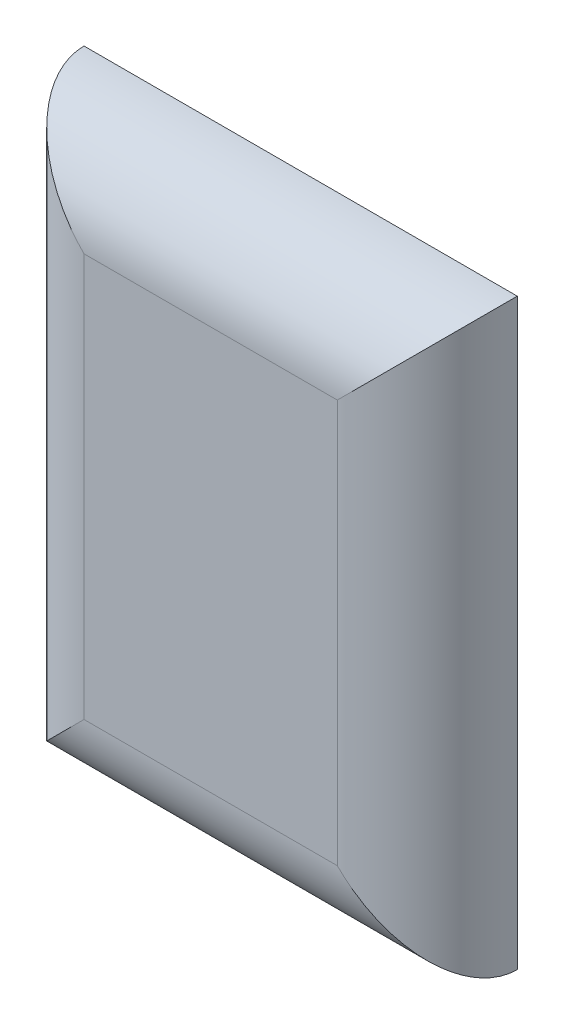
ISO-10303-21;
HEADER;
FILE_DESCRIPTION(('STEP AP214'),'2;1');
FILE_NAME('part.step','',(''),(''),'','','');
FILE_SCHEMA(('AUTOMOTIVE_DESIGN { 1 0 10303 214 1 1 1 1 }'));
ENDSEC;
DATA;
#1=APPLICATION_CONTEXT('core data for automotive mechanical design processes');
#2=APPLICATION_PROTOCOL_DEFINITION('international standard','automotive_design',2000,#1);
#3=PRODUCT_CONTEXT('',#1,'mechanical');
#4=PRODUCT('Part','Part','',(#3));
#5=PRODUCT_RELATED_PRODUCT_CATEGORY('part','',(#4));
#6=PRODUCT_DEFINITION_FORMATION('','',#4);
#7=PRODUCT_DEFINITION_CONTEXT('part definition',#1,'design');
#8=PRODUCT_DEFINITION('design','',#6,#7);
#9=PRODUCT_DEFINITION_SHAPE('','',#8);
#10=(LENGTH_UNIT() NAMED_UNIT(*) SI_UNIT(.MILLI.,.METRE.));
#11=(NAMED_UNIT(*) PLANE_ANGLE_UNIT() SI_UNIT($,.RADIAN.));
#12=(NAMED_UNIT(*) SI_UNIT($,.STERADIAN.) SOLID_ANGLE_UNIT());
#13=UNCERTAINTY_MEASURE_WITH_UNIT(LENGTH_MEASURE(1.E-05),#10,'distance_accuracy_value','');
#14=(GEOMETRIC_REPRESENTATION_CONTEXT(3) GLOBAL_UNCERTAINTY_ASSIGNED_CONTEXT((#13)) GLOBAL_UNIT_ASSIGNED_CONTEXT((#10,
#11,#12)) REPRESENTATION_CONTEXT('',''));
#15=CARTESIAN_POINT('',(0.,0.,0.));
#16=DIRECTION('',(0.,0.,1.));
#17=DIRECTION('',(1.,0.,0.));
#18=AXIS2_PLACEMENT_3D('',#15,#16,#17);
#19=CARTESIAN_POINT('',(0.,0.,54.));
#20=DIRECTION('',(0.,0.,1.));
#21=DIRECTION('',(1.,0.,0.));
#22=AXIS2_PLACEMENT_3D('',#19,#20,#21);
#23=PLANE('',#22);
#24=DIRECTION('',(0.,-1.,0.));
#25=VECTOR('',#24,1.);
#26=CARTESIAN_POINT('',(-76.,-175.,54.));
#27=LINE('',#26,#25);
#28=CARTESIAN_POINT('',(-76.,121.,54.));
#29=VERTEX_POINT('',#28);
#30=CARTESIAN_POINT('',(-76.,-121.,54.));
#31=VERTEX_POINT('',#30);
#32=EDGE_CURVE('E54',#29,#31,#27,.T.);
#33=ORIENTED_EDGE('',*,*,#32,.T.);
#34=DIRECTION('',(1.,0.,0.));
#35=VECTOR('',#34,1.);
#36=CARTESIAN_POINT('',(130.,-121.,54.));
#37=LINE('',#36,#35);
#38=CARTESIAN_POINT('',(76.,-121.,54.));
#39=VERTEX_POINT('',#38);
#40=EDGE_CURVE('E11',#31,#39,#37,.T.);
#41=ORIENTED_EDGE('',*,*,#40,.T.);
#42=DIRECTION('',(0.,1.,0.));
#43=VECTOR('',#42,1.);
#44=CARTESIAN_POINT('',(76.,175.,54.));
#45=LINE('',#44,#43);
#46=CARTESIAN_POINT('',(76.,121.,54.));
#47=VERTEX_POINT('',#46);
#48=EDGE_CURVE('E43',#39,#47,#45,.T.);
#49=ORIENTED_EDGE('',*,*,#48,.T.);
#50=DIRECTION('',(-1.,0.,0.));
#51=VECTOR('',#50,1.);
#52=CARTESIAN_POINT('',(-130.,121.,54.));
#53=LINE('',#52,#51);
#54=EDGE_CURVE('E100',#47,#29,#53,.T.);
#55=ORIENTED_EDGE('',*,*,#54,.T.);
#56=EDGE_LOOP('',(#33,#41,#49,#55));
#57=FACE_BOUND('',#56,.T.);
#58=ADVANCED_FACE('F34',(#57),#23,.T.);
#59=CARTESIAN_POINT('',(0.,0.,0.));
#60=DIRECTION('',(0.,0.,1.));
#61=DIRECTION('',(1.,0.,0.));
#62=AXIS2_PLACEMENT_3D('',#59,#60,#61);
#63=PLANE('',#62);
#64=DIRECTION('',(0.,-1.,0.));
#65=VECTOR('',#64,1.);
#66=CARTESIAN_POINT('',(-130.,175.,0.));
#67=LINE('',#66,#65);
#68=CARTESIAN_POINT('',(-130.,175.,0.));
#69=VERTEX_POINT('',#68);
#70=CARTESIAN_POINT('',(-130.,-175.,0.));
#71=VERTEX_POINT('',#70);
#72=EDGE_CURVE('E78',#69,#71,#67,.T.);
#73=ORIENTED_EDGE('',*,*,#72,.F.);
#74=DIRECTION('',(-1.,0.,0.));
#75=VECTOR('',#74,1.);
#76=CARTESIAN_POINT('',(-130.,175.,0.));
#77=LINE('',#76,#75);
#78=CARTESIAN_POINT('',(130.,175.,0.));
#79=VERTEX_POINT('',#78);
#80=EDGE_CURVE('E102',#79,#69,#77,.T.);
#81=ORIENTED_EDGE('',*,*,#80,.F.);
#82=DIRECTION('',(0.,1.,0.));
#83=VECTOR('',#82,1.);
#84=CARTESIAN_POINT('',(130.,175.,0.));
#85=LINE('',#84,#83);
#86=CARTESIAN_POINT('',(130.,-175.,0.));
#87=VERTEX_POINT('',#86);
#88=EDGE_CURVE('E81',#87,#79,#85,.T.);
#89=ORIENTED_EDGE('',*,*,#88,.F.);
#90=DIRECTION('',(1.,0.,0.));
#91=VECTOR('',#90,1.);
#92=CARTESIAN_POINT('',(-130.,-175.,0.));
#93=LINE('',#92,#91);
#94=EDGE_CURVE('E75',#71,#87,#93,.T.);
#95=ORIENTED_EDGE('',*,*,#94,.F.);
#96=EDGE_LOOP('',(#73,#81,#89,#95));
#97=FACE_BOUND('',#96,.T.);
#98=ADVANCED_FACE('F77',(#97),#63,.F.);
#99=CARTESIAN_POINT('',(-76.,0.,0.));
#100=DIRECTION('',(0.,1.,0.));
#101=DIRECTION('',(-1.,0.,0.));
#102=AXIS2_PLACEMENT_3D('',#99,#100,#101);
#103=CYLINDRICAL_SURFACE('',#102,54.);
#104=CARTESIAN_POINT('',(-76.,121.,0.));
#105=DIRECTION('',(0.707106781186547,0.707106781186548,0.));
#106=DIRECTION('',(0.707106781186548,-0.707106781186547,0.));
#107=AXIS2_PLACEMENT_3D('',#104,#105,#106);
#108=ELLIPSE('',#107,76.3675323681471,54.);
#109=EDGE_CURVE('E87',#69,#29,#108,.T.);
#110=ORIENTED_EDGE('',*,*,#109,.F.);
#111=ORIENTED_EDGE('',*,*,#72,.T.);
#112=CARTESIAN_POINT('',(-76.,-121.,0.));
#113=DIRECTION('',(-0.707106781186548,0.707106781186547,0.));
#114=DIRECTION('',(-0.707106781186547,-0.707106781186548,0.));
#115=AXIS2_PLACEMENT_3D('',#112,#113,#114);
#116=ELLIPSE('',#115,76.3675323681471,54.);
#117=EDGE_CURVE('E38',#31,#71,#116,.F.);
#118=ORIENTED_EDGE('',*,*,#117,.F.);
#119=ORIENTED_EDGE('',*,*,#32,.F.);
#120=EDGE_LOOP('',(#110,#111,#118,#119));
#121=FACE_BOUND('',#120,.T.);
#122=ADVANCED_FACE('F36',(#121),#103,.T.);
#123=CARTESIAN_POINT('',(0.,-121.,0.));
#124=DIRECTION('',(-1.,0.,0.));
#125=DIRECTION('',(0.,-1.,0.));
#126=AXIS2_PLACEMENT_3D('',#123,#124,#125);
#127=CYLINDRICAL_SURFACE('',#126,54.);
#128=ORIENTED_EDGE('',*,*,#117,.T.);
#129=ORIENTED_EDGE('',*,*,#94,.T.);
#130=CARTESIAN_POINT('',(76.,-121.,0.));
#131=DIRECTION('',(-0.707106781186547,-0.707106781186548,0.));
#132=DIRECTION('',(-0.707106781186548,0.707106781186547,0.));
#133=AXIS2_PLACEMENT_3D('',#130,#131,#132);
#134=ELLIPSE('',#133,76.3675323681471,54.);
#135=EDGE_CURVE('E91',#39,#87,#134,.F.);
#136=ORIENTED_EDGE('',*,*,#135,.F.);
#137=ORIENTED_EDGE('',*,*,#40,.F.);
#138=EDGE_LOOP('',(#128,#129,#136,#137));
#139=FACE_BOUND('',#138,.T.);
#140=ADVANCED_FACE('F90',(#139),#127,.T.);
#141=CARTESIAN_POINT('',(0.,121.,0.));
#142=DIRECTION('',(1.,0.,0.));
#143=DIRECTION('',(0.,1.,0.));
#144=AXIS2_PLACEMENT_3D('',#141,#142,#143);
#145=CYLINDRICAL_SURFACE('',#144,54.);
#146=ORIENTED_EDGE('',*,*,#109,.T.);
#147=ORIENTED_EDGE('',*,*,#54,.F.);
#148=CARTESIAN_POINT('',(76.,121.,0.));
#149=DIRECTION('',(0.707106781186548,-0.707106781186547,0.));
#150=DIRECTION('',(0.707106781186547,0.707106781186548,0.));
#151=AXIS2_PLACEMENT_3D('',#148,#149,#150);
#152=ELLIPSE('',#151,76.3675323681471,54.);
#153=EDGE_CURVE('E94',#79,#47,#152,.T.);
#154=ORIENTED_EDGE('',*,*,#153,.F.);
#155=ORIENTED_EDGE('',*,*,#80,.T.);
#156=EDGE_LOOP('',(#146,#147,#154,#155));
#157=FACE_BOUND('',#156,.T.);
#158=ADVANCED_FACE('F108',(#157),#145,.T.);
#159=CARTESIAN_POINT('',(76.,0.,0.));
#160=DIRECTION('',(0.,-1.,0.));
#161=DIRECTION('',(1.,0.,0.));
#162=AXIS2_PLACEMENT_3D('',#159,#160,#161);
#163=CYLINDRICAL_SURFACE('',#162,54.);
#164=ORIENTED_EDGE('',*,*,#135,.T.);
#165=ORIENTED_EDGE('',*,*,#88,.T.);
#166=ORIENTED_EDGE('',*,*,#153,.T.);
#167=ORIENTED_EDGE('',*,*,#48,.F.);
#168=EDGE_LOOP('',(#164,#165,#166,#167));
#169=FACE_BOUND('',#168,.T.);
#170=ADVANCED_FACE('F106',(#169),#163,.T.);
#171=CLOSED_SHELL('',(#58,#98,#122,#140,#158,#170));
#172=MANIFOLD_SOLID_BREP('B2',#171);
#173=ADVANCED_BREP_SHAPE_REPRESENTATION('',(#18,#172),#14);
#174=SHAPE_DEFINITION_REPRESENTATION(#9,#173);
ENDSEC;
END-ISO-10303-21;
